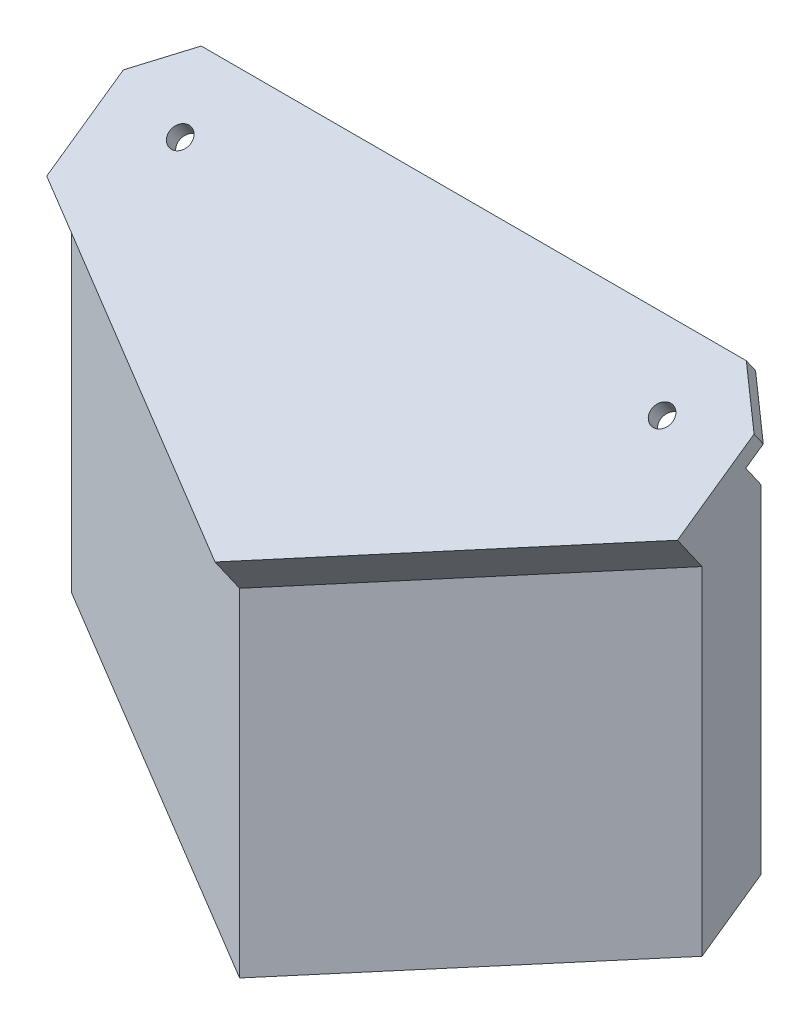
ISO-10303-21;
HEADER;
FILE_DESCRIPTION(('STEP AP214'),'2;1');
FILE_NAME('part.step','',(''),(''),'','','');
FILE_SCHEMA(('AUTOMOTIVE_DESIGN { 1 0 10303 214 1 1 1 1 }'));
ENDSEC;
DATA;
#1=APPLICATION_CONTEXT('core data for automotive mechanical design processes');
#2=APPLICATION_PROTOCOL_DEFINITION('international standard','automotive_design',2000,#1);
#3=PRODUCT_CONTEXT('',#1,'mechanical');
#4=PRODUCT('Part','Part','',(#3));
#5=PRODUCT_RELATED_PRODUCT_CATEGORY('part','',(#4));
#6=PRODUCT_DEFINITION_FORMATION('','',#4);
#7=PRODUCT_DEFINITION_CONTEXT('part definition',#1,'design');
#8=PRODUCT_DEFINITION('design','',#6,#7);
#9=PRODUCT_DEFINITION_SHAPE('','',#8);
#10=(LENGTH_UNIT() NAMED_UNIT(*) SI_UNIT(.MILLI.,.METRE.));
#11=(NAMED_UNIT(*) PLANE_ANGLE_UNIT() SI_UNIT($,.RADIAN.));
#12=(NAMED_UNIT(*) SI_UNIT($,.STERADIAN.) SOLID_ANGLE_UNIT());
#13=UNCERTAINTY_MEASURE_WITH_UNIT(LENGTH_MEASURE(1.E-05),#10,'distance_accuracy_value','');
#14=(GEOMETRIC_REPRESENTATION_CONTEXT(3) GLOBAL_UNCERTAINTY_ASSIGNED_CONTEXT((#13)) GLOBAL_UNIT_ASSIGNED_CONTEXT((#10,
#11,#12)) REPRESENTATION_CONTEXT('',''));
#15=CARTESIAN_POINT('',(0.,0.,0.));
#16=DIRECTION('',(0.,0.,1.));
#17=DIRECTION('',(1.,0.,0.));
#18=AXIS2_PLACEMENT_3D('',#15,#16,#17);
#19=CARTESIAN_POINT('',(45.,122.341674123379,-4.82430299363382));
#20=DIRECTION('',(0.,-0.819152044288995,-0.573576436351042));
#21=DIRECTION('',(0.,0.573576436351042,-0.819152044288995));
#22=AXIS2_PLACEMENT_3D('',#19,#20,#21);
#23=CYLINDRICAL_SURFACE('',#22,2.);
#24=CARTESIAN_POINT('',(45.,96.5532163543121,-22.8815755223373));
#25=DIRECTION('',(0.,-0.819152044288995,-0.573576436351042));
#26=DIRECTION('',(0.,0.573576436351042,-0.819152044288995));
#27=AXIS2_PLACEMENT_3D('',#24,#25,#26);
#28=CIRCLE('',#27,2.);
#29=CARTESIAN_POINT('',(45.,97.7003692270141,-24.5198796109152));
#30=VERTEX_POINT('',#29);
#31=EDGE_CURVE('E172',#30,#30,#28,.T.);
#32=ORIENTED_EDGE('',*,*,#31,.F.);
#33=EDGE_LOOP('',(#32));
#34=FACE_BOUND('',#33,.T.);
#35=CARTESIAN_POINT('',(45.,94.0957602214451,-24.6023048313904));
#36=DIRECTION('',(0.,-0.819152044288995,-0.573576436351041));
#37=DIRECTION('',(0.,0.573576436351041,-0.819152044288995));
#38=AXIS2_PLACEMENT_3D('',#35,#36,#37);
#39=CIRCLE('',#38,2.);
#40=CARTESIAN_POINT('',(45.,95.2429130941472,-26.2406089199683));
#41=VERTEX_POINT('',#40);
#42=EDGE_CURVE('E167',#41,#41,#39,.F.);
#43=ORIENTED_EDGE('',*,*,#42,.F.);
#44=EDGE_LOOP('',(#43));
#45=FACE_BOUND('',#44,.T.);
#46=ADVANCED_FACE('F37',(#34,#45),#23,.F.);
#47=CARTESIAN_POINT('',(-45.,122.341674123379,-4.82430299363382));
#48=DIRECTION('',(0.,-0.819152044288995,-0.573576436351042));
#49=DIRECTION('',(0.,0.573576436351042,-0.819152044288995));
#50=AXIS2_PLACEMENT_3D('',#47,#48,#49);
#51=CYLINDRICAL_SURFACE('',#50,2.);
#52=CARTESIAN_POINT('',(-45.,96.5532163543121,-22.8815755223373));
#53=DIRECTION('',(0.,-0.819152044288995,-0.573576436351042));
#54=DIRECTION('',(0.,0.573576436351042,-0.819152044288995));
#55=AXIS2_PLACEMENT_3D('',#52,#53,#54);
#56=CIRCLE('',#55,2.);
#57=CARTESIAN_POINT('',(-45.,97.7003692270141,-24.5198796109152));
#58=VERTEX_POINT('',#57);
#59=EDGE_CURVE('E175',#58,#58,#56,.T.);
#60=ORIENTED_EDGE('',*,*,#59,.F.);
#61=EDGE_LOOP('',(#60));
#62=FACE_BOUND('',#61,.T.);
#63=CARTESIAN_POINT('',(-45.,94.0957602214451,-24.6023048313904));
#64=DIRECTION('',(0.,-0.819152044288995,-0.573576436351041));
#65=DIRECTION('',(0.,0.573576436351041,-0.819152044288995));
#66=AXIS2_PLACEMENT_3D('',#63,#64,#65);
#67=CIRCLE('',#66,2.);
#68=CARTESIAN_POINT('',(-45.,95.2429130941472,-26.2406089199684));
#69=VERTEX_POINT('',#68);
#70=EDGE_CURVE('E164',#69,#69,#67,.F.);
#71=ORIENTED_EDGE('',*,*,#70,.F.);
#72=EDGE_LOOP('',(#71));
#73=FACE_BOUND('',#72,.T.);
#74=ADVANCED_FACE('F261',(#62,#73),#51,.F.);
#75=CARTESIAN_POINT('',(-58.9100061573822,113.265958121992,-25.8284828175927));
#76=DIRECTION('',(0.,-0.573576436351042,0.819152044288995));
#77=DIRECTION('',(0.,-0.819152044288995,-0.573576436351042));
#78=AXIS2_PLACEMENT_3D('',#75,#76,#77);
#79=PLANE('',#78);
#80=DIRECTION('',(-1.,0.,0.));
#81=VECTOR('',#80,1.);
#82=CARTESIAN_POINT('',(0.,103.436133590525,-32.7114000538052));
#83=LINE('',#82,#81);
#84=CARTESIAN_POINT('',(50.9100061573822,103.436133590525,-32.7114000538052));
#85=VERTEX_POINT('',#84);
#86=CARTESIAN_POINT('',(-50.9100061573822,103.436133590525,-32.7114000538052));
#87=VERTEX_POINT('',#86);
#88=EDGE_CURVE('E170',#85,#87,#83,.T.);
#89=ORIENTED_EDGE('',*,*,#88,.F.);
#90=DIRECTION('',(0.,-0.819152044288995,-0.573576436351042));
#91=VECTOR('',#90,1.);
#92=CARTESIAN_POINT('',(50.9100061573822,113.265958121992,-25.8284828175927));
#93=LINE('',#92,#91);
#94=CARTESIAN_POINT('',(50.9100061573822,100.978677457658,-34.4321293628584));
#95=VERTEX_POINT('',#94);
#96=EDGE_CURVE('E233',#85,#95,#93,.T.);
#97=ORIENTED_EDGE('',*,*,#96,.T.);
#98=DIRECTION('',(1.,0.,0.));
#99=VECTOR('',#98,1.);
#100=CARTESIAN_POINT('',(-58.9100061573822,100.978677457658,-34.4321293628583));
#101=LINE('',#100,#99);
#102=CARTESIAN_POINT('',(-50.9100061573822,100.978677457658,-34.4321293628583));
#103=VERTEX_POINT('',#102);
#104=EDGE_CURVE('E144',#103,#95,#101,.T.);
#105=ORIENTED_EDGE('',*,*,#104,.F.);
#106=DIRECTION('',(0.,0.819152044288995,0.573576436351042));
#107=VECTOR('',#106,1.);
#108=CARTESIAN_POINT('',(-50.9100061573822,113.265958121992,-25.8284828175927));
#109=LINE('',#108,#107);
#110=EDGE_CURVE('E231',#103,#87,#109,.T.);
#111=ORIENTED_EDGE('',*,*,#110,.T.);
#112=EDGE_LOOP('',(#89,#97,#105,#111));
#113=FACE_BOUND('',#112,.T.);
#114=ADVANCED_FACE('F246',(#113),#79,.F.);
#115=CARTESIAN_POINT('',(4.22618261740701,90.,9.06307787036649));
#116=DIRECTION('',(-0.422618261740701,0.,-0.906307787036649));
#117=DIRECTION('',(-0.906307787036649,0.,0.422618261740701));
#118=AXIS2_PLACEMENT_3D('',#115,#116,#117);
#119=PLANE('',#118);
#120=DIRECTION('',(0.,-1.,0.));
#121=VECTOR('',#120,1.);
#122=CARTESIAN_POINT('',(58.9100061573822,90.,-16.4364078235206));
#123=LINE('',#122,#121);
#124=CARTESIAN_POINT('',(58.9100061573822,82.2740646364833,-16.4364078235206));
#125=VERTEX_POINT('',#124);
#126=CARTESIAN_POINT('',(58.9100061573822,19.2348320226348,-16.4364078235206));
#127=VERTEX_POINT('',#126);
#128=EDGE_CURVE('E180',#125,#127,#123,.T.);
#129=ORIENTED_EDGE('',*,*,#128,.F.);
#130=DIRECTION('',(-0.869055102665145,-0.283757039059194,0.405247049731437));
#131=VECTOR('',#130,1.);
#132=CARTESIAN_POINT('',(10.5344373945289,66.4788542834744,6.1214903582017));
#133=LINE('',#132,#131);
#134=CARTESIAN_POINT('',(0.,63.0392326138486,11.0337791896249));
#135=VERTEX_POINT('',#134);
#136=EDGE_CURVE('E220',#125,#135,#133,.T.);
#137=ORIENTED_EDGE('',*,*,#136,.T.);
#138=DIRECTION('',(0.,-1.,0.));
#139=VECTOR('',#138,1.);
#140=CARTESIAN_POINT('',(0.,90.,11.0337791896249));
#141=LINE('',#140,#139);
#142=CARTESIAN_POINT('',(0.,0.,11.0337791896249));
#143=VERTEX_POINT('',#142);
#144=EDGE_CURVE('E222',#135,#143,#141,.T.);
#145=ORIENTED_EDGE('',*,*,#144,.T.);
#146=DIRECTION('',(0.869055102665145,0.283757039059194,-0.405247049731437));
#147=VECTOR('',#146,1.);
#148=CARTESIAN_POINT('',(26.079943847654,8.51541820805782,-1.1274983507885));
#149=LINE('',#148,#147);
#150=EDGE_CURVE('E210',#143,#127,#149,.T.);
#151=ORIENTED_EDGE('',*,*,#150,.T.);
#152=EDGE_LOOP('',(#129,#137,#145,#151));
#153=FACE_BOUND('',#152,.T.);
#154=ADVANCED_FACE('F299',(#153),#119,.F.);
#155=CARTESIAN_POINT('',(-63.1361887747892,90.,-18.4071091427791));
#156=DIRECTION('',(0.422618261740701,0.,-0.906307787036649));
#157=DIRECTION('',(-0.906307787036649,0.,-0.422618261740701));
#158=AXIS2_PLACEMENT_3D('',#155,#156,#157);
#159=PLANE('',#158);
#160=DIRECTION('',(0.,1.,0.));
#161=VECTOR('',#160,1.);
#162=CARTESIAN_POINT('',(-58.9100061573822,90.,-16.4364078235206));
#163=LINE('',#162,#161);
#164=CARTESIAN_POINT('',(-58.9100061573822,19.2348320226348,-16.4364078235206));
#165=VERTEX_POINT('',#164);
#166=CARTESIAN_POINT('',(-58.9100061573822,82.2740646364833,-16.4364078235206));
#167=VERTEX_POINT('',#166);
#168=EDGE_CURVE('E187',#165,#167,#163,.T.);
#169=ORIENTED_EDGE('',*,*,#168,.F.);
#170=DIRECTION('',(0.869055102665145,-0.283757039059194,0.405247049731437));
#171=VECTOR('',#170,1.);
#172=CARTESIAN_POINT('',(-80.2466307586823,26.2014989253608,-26.3858392742852));
#173=LINE('',#172,#171);
#174=EDGE_CURVE('E203',#165,#143,#173,.T.);
#175=ORIENTED_EDGE('',*,*,#174,.T.);
#176=ORIENTED_EDGE('',*,*,#144,.F.);
#177=DIRECTION('',(-0.869055102665145,0.283757039059194,-0.405247049731437));
#178=VECTOR('',#177,1.);
#179=CARTESIAN_POINT('',(-64.7011243055572,84.1649350007774,-19.136850565295));
#180=LINE('',#179,#178);
#181=EDGE_CURVE('E213',#135,#167,#180,.T.);
#182=ORIENTED_EDGE('',*,*,#181,.T.);
#183=EDGE_LOOP('',(#169,#175,#176,#182));
#184=FACE_BOUND('',#183,.T.);
#185=ADVANCED_FACE('F295',(#184),#159,.F.);
#186=CARTESIAN_POINT('',(-63.1361887747892,0.,11.0337791896249));
#187=DIRECTION('',(0.,0.819152044288995,0.573576436351042));
#188=DIRECTION('',(0.,-0.573576436351042,0.819152044288995));
#189=AXIS2_PLACEMENT_3D('',#186,#187,#188);
#190=PLANE('',#189);
#191=DIRECTION('',(0.,-0.573576436351042,0.819152044288995));
#192=VECTOR('',#191,1.);
#193=CARTESIAN_POINT('',(-58.9100061573822,0.,11.0337791896249));
#194=LINE('',#193,#192);
#195=CARTESIAN_POINT('',(-58.9100061573822,26.9607673861515,-27.4701870131455));
#196=VERTEX_POINT('',#195);
#197=EDGE_CURVE('E189',#196,#165,#194,.T.);
#198=ORIENTED_EDGE('',*,*,#197,.F.);
#199=DIRECTION('',(0.869055102665145,-0.283757039059194,0.405247049731437));
#200=VECTOR('',#199,1.);
#201=CARTESIAN_POINT('',(-74.4555126105073,32.0365639245834,-34.7191757221358));
#202=LINE('',#201,#200);
#203=CARTESIAN_POINT('',(0.,7.72593536351671,0.));
#204=VERTEX_POINT('',#203);
#205=EDGE_CURVE('E205',#196,#204,#202,.T.);
#206=ORIENTED_EDGE('',*,*,#205,.T.);
#207=DIRECTION('',(0.869055102665145,0.283757039059194,-0.405247049731437));
#208=VECTOR('',#207,1.);
#209=CARTESIAN_POINT('',(20.288825699479,14.3504832072804,-9.46083479863902));
#210=LINE('',#209,#208);
#211=CARTESIAN_POINT('',(58.9100061573822,26.9607673861515,-27.4701870131455));
#212=VERTEX_POINT('',#211);
#213=EDGE_CURVE('E207',#204,#212,#210,.T.);
#214=ORIENTED_EDGE('',*,*,#213,.T.);
#215=DIRECTION('',(0.,0.573576436351042,-0.819152044288995));
#216=VECTOR('',#215,1.);
#217=CARTESIAN_POINT('',(58.9100061573822,0.,11.0337791896249));
#218=LINE('',#217,#216);
#219=EDGE_CURVE('E182',#127,#212,#218,.T.);
#220=ORIENTED_EDGE('',*,*,#219,.F.);
#221=ORIENTED_EDGE('',*,*,#150,.F.);
#222=ORIENTED_EDGE('',*,*,#174,.F.);
#223=EDGE_LOOP('',(#198,#206,#214,#220,#221,#222));
#224=FACE_BOUND('',#223,.T.);
#225=ADVANCED_FACE('F291',(#224),#190,.F.);
#226=CARTESIAN_POINT('',(63.1361887747892,90.2071809100998,-13.8184976519707));
#227=DIRECTION('',(-0.494715300482687,0.498469528779363,-0.711888263947936));
#228=DIRECTION('',(0.,0.819152044288995,0.573576436351042));
#229=AXIS2_PLACEMENT_3D('',#226,#227,#228);
#230=PLANE('',#229);
#231=DIRECTION('',(0.,-0.819152044288995,-0.573576436351042));
#232=VECTOR('',#231,1.);
#233=CARTESIAN_POINT('',(58.9100061573822,88.8272809907953,-11.8477963327123));
#234=LINE('',#233,#232);
#235=CARTESIAN_POINT('',(58.9100061573822,88.8272809907953,-11.8477963327123));
#236=VERTEX_POINT('',#235);
#237=EDGE_CURVE('E178',#236,#125,#234,.T.);
#238=ORIENTED_EDGE('',*,*,#237,.F.);
#239=DIRECTION('',(0.869055102665145,0.283757039059194,-0.405247049731437));
#240=VECTOR('',#239,1.);
#241=CARTESIAN_POINT('',(63.1361887747892,90.2071809100998,-13.8184976519707));
#242=LINE('',#241,#240);
#243=CARTESIAN_POINT('',(0.,69.5924489681605,15.6223906804333));
#244=VERTEX_POINT('',#243);
#245=EDGE_CURVE('E191',#244,#236,#242,.T.);
#246=ORIENTED_EDGE('',*,*,#245,.F.);
#247=DIRECTION('',(0.,-0.819152044288995,-0.573576436351042));
#248=VECTOR('',#247,1.);
#249=CARTESIAN_POINT('',(0.,69.5924489681605,15.6223906804333));
#250=LINE('',#249,#248);
#251=EDGE_CURVE('E200',#244,#135,#250,.T.);
#252=ORIENTED_EDGE('',*,*,#251,.T.);
#253=ORIENTED_EDGE('',*,*,#136,.F.);
#254=EDGE_LOOP('',(#238,#246,#252,#253));
#255=FACE_BOUND('',#254,.T.);
#256=ADVANCED_FACE('F280',(#255),#230,.F.);
#257=CARTESIAN_POINT('',(0.,69.5924489681605,15.6223906804333));
#258=DIRECTION('',(0.494715300482687,0.498469528779363,-0.711888263947936));
#259=DIRECTION('',(0.,0.819152044288995,0.573576436351042));
#260=AXIS2_PLACEMENT_3D('',#257,#258,#259);
#261=PLANE('',#260);
#262=DIRECTION('',(0.,0.819152044288995,0.573576436351042));
#263=VECTOR('',#262,1.);
#264=CARTESIAN_POINT('',(-58.9100061573822,88.8272809907953,-11.8477963327123));
#265=LINE('',#264,#263);
#266=CARTESIAN_POINT('',(-58.9100061573822,88.8272809907953,-11.8477963327123));
#267=VERTEX_POINT('',#266);
#268=EDGE_CURVE('E184',#167,#267,#265,.T.);
#269=ORIENTED_EDGE('',*,*,#268,.F.);
#270=ORIENTED_EDGE('',*,*,#181,.F.);
#271=ORIENTED_EDGE('',*,*,#251,.F.);
#272=DIRECTION('',(0.869055102665145,-0.283757039059194,0.405247049731437));
#273=VECTOR('',#272,1.);
#274=CARTESIAN_POINT('',(0.,69.5924489681605,15.6223906804333));
#275=LINE('',#274,#273);
#276=EDGE_CURVE('E198',#267,#244,#275,.T.);
#277=ORIENTED_EDGE('',*,*,#276,.F.);
#278=EDGE_LOOP('',(#269,#270,#271,#277));
#279=FACE_BOUND('',#278,.T.);
#280=ADVANCED_FACE('F276',(#279),#261,.F.);
#281=CARTESIAN_POINT('',(0.,54.0373567900367,37.8373645693109));
#282=DIRECTION('',(0.,-0.819152044288995,-0.573576436351042));
#283=DIRECTION('',(0.,0.573576436351042,-0.819152044288995));
#284=AXIS2_PLACEMENT_3D('',#281,#282,#283);
#285=PLANE('',#284);
#286=ORIENTED_EDGE('',*,*,#59,.T.);
#287=EDGE_LOOP('',(#286));
#288=FACE_BOUND('',#287,.T.);
#289=ORIENTED_EDGE('',*,*,#31,.T.);
#290=EDGE_LOOP('',(#289));
#291=FACE_BOUND('',#290,.T.);
#292=DIRECTION('',(0.,0.573576436351042,-0.819152044288995));
#293=VECTOR('',#292,1.);
#294=CARTESIAN_POINT('',(58.9100061573822,96.553216354312,-22.8815755223372));
#295=LINE('',#294,#293);
#296=CARTESIAN_POINT('',(58.9100061573822,98.8475220997162,-26.1581836994932));
#297=VERTEX_POINT('',#296);
#298=EDGE_CURVE('E194',#236,#297,#295,.T.);
#299=ORIENTED_EDGE('',*,*,#298,.T.);
#300=DIRECTION('',(0.707106781186546,-0.405579787672637,0.579227965339572));
#301=VECTOR('',#300,1.);
#302=CARTESIAN_POINT('',(50.9100061573822,103.436133590525,-32.7114000538052));
#303=LINE('',#302,#301);
#304=EDGE_CURVE('E46',#297,#85,#303,.F.);
#305=ORIENTED_EDGE('',*,*,#304,.T.);
#306=ORIENTED_EDGE('',*,*,#88,.T.);
#307=DIRECTION('',(0.707106781186548,0.405579787672636,-0.579227965339571));
#308=VECTOR('',#307,1.);
#309=CARTESIAN_POINT('',(-58.9100061573822,98.8475220997162,-26.1581836994932));
#310=LINE('',#309,#308);
#311=CARTESIAN_POINT('',(-58.9100061573822,98.8475220997162,-26.1581836994932));
#312=VERTEX_POINT('',#311);
#313=EDGE_CURVE('E53',#87,#312,#310,.F.);
#314=ORIENTED_EDGE('',*,*,#313,.T.);
#315=DIRECTION('',(0.,-0.573576436351042,0.819152044288995));
#316=VECTOR('',#315,1.);
#317=CARTESIAN_POINT('',(-58.9100061573822,96.553216354312,-22.8815755223372));
#318=LINE('',#317,#316);
#319=EDGE_CURVE('E196',#312,#267,#318,.T.);
#320=ORIENTED_EDGE('',*,*,#319,.T.);
#321=ORIENTED_EDGE('',*,*,#276,.T.);
#322=ORIENTED_EDGE('',*,*,#245,.T.);
#323=EDGE_LOOP('',(#299,#305,#306,#314,#320,#321,#322));
#324=FACE_BOUND('',#323,.T.);
#325=ADVANCED_FACE('F242',(#288,#291,#324),#285,.F.);
#326=CARTESIAN_POINT('',(0.,90.,0.));
#327=DIRECTION('',(-0.422618261740701,0.,-0.906307787036649));
#328=DIRECTION('',(-0.906307787036649,0.,0.422618261740701));
#329=AXIS2_PLACEMENT_3D('',#326,#327,#328);
#330=PLANE('',#329);
#331=ORIENTED_EDGE('',*,*,#213,.F.);
#332=DIRECTION('',(0.,-1.,0.));
#333=VECTOR('',#332,1.);
#334=CARTESIAN_POINT('',(0.,90.,0.));
#335=LINE('',#334,#333);
#336=CARTESIAN_POINT('',(0.,70.7651679773653,0.));
#337=VERTEX_POINT('',#336);
#338=EDGE_CURVE('E227',#337,#204,#335,.T.);
#339=ORIENTED_EDGE('',*,*,#338,.F.);
#340=DIRECTION('',(-0.869055102665145,-0.283757039059194,0.405247049731437));
#341=VECTOR('',#340,1.);
#342=CARTESIAN_POINT('',(4.74331924635387,72.313919282697,-2.21184608964881));
#343=LINE('',#342,#341);
#344=CARTESIAN_POINT('',(58.9100061573822,90.0000000000001,-27.4701870131456));
#345=VERTEX_POINT('',#344);
#346=EDGE_CURVE('E218',#345,#337,#343,.T.);
#347=ORIENTED_EDGE('',*,*,#346,.F.);
#348=DIRECTION('',(0.,-1.,0.));
#349=VECTOR('',#348,1.);
#350=CARTESIAN_POINT('',(58.9100061573822,90.,-27.4701870131455));
#351=LINE('',#350,#349);
#352=EDGE_CURVE('E156',#345,#212,#351,.T.);
#353=ORIENTED_EDGE('',*,*,#352,.T.);
#354=EDGE_LOOP('',(#331,#339,#347,#353));
#355=FACE_BOUND('',#354,.T.);
#356=ADVANCED_FACE('F275',(#355),#330,.T.);
#357=CARTESIAN_POINT('',(-58.9100061573822,90.,-27.4701870131456));
#358=DIRECTION('',(0.422618261740701,0.,-0.906307787036649));
#359=DIRECTION('',(-0.906307787036649,0.,-0.422618261740701));
#360=AXIS2_PLACEMENT_3D('',#357,#358,#359);
#361=PLANE('',#360);
#362=ORIENTED_EDGE('',*,*,#205,.F.);
#363=DIRECTION('',(0.,-1.,0.));
#364=VECTOR('',#363,1.);
#365=CARTESIAN_POINT('',(-58.9100061573822,90.,-27.4701870131456));
#366=LINE('',#365,#364);
#367=CARTESIAN_POINT('',(-58.9100061573822,90.0000000000001,-27.4701870131455));
#368=VERTEX_POINT('',#367);
#369=EDGE_CURVE('E225',#368,#196,#366,.T.);
#370=ORIENTED_EDGE('',*,*,#369,.F.);
#371=DIRECTION('',(-0.869055102665145,0.283757039059194,-0.405247049731437));
#372=VECTOR('',#371,1.);
#373=CARTESIAN_POINT('',(-58.9100061573822,90.,-27.4701870131456));
#374=LINE('',#373,#372);
#375=EDGE_CURVE('E216',#337,#368,#374,.T.);
#376=ORIENTED_EDGE('',*,*,#375,.F.);
#377=ORIENTED_EDGE('',*,*,#338,.T.);
#378=EDGE_LOOP('',(#362,#370,#376,#377));
#379=FACE_BOUND('',#378,.T.);
#380=ADVANCED_FACE('F288',(#379),#361,.T.);
#381=CARTESIAN_POINT('',(58.9100061573822,96.553216354312,-22.8815755223372));
#382=DIRECTION('',(-1.,0.,0.));
#383=DIRECTION('',(0.,0.,1.));
#384=AXIS2_PLACEMENT_3D('',#381,#382,#383);
#385=PLANE('',#384);
#386=DIRECTION('',(0.,-0.573576436351042,0.819152044288995));
#387=VECTOR('',#386,1.);
#388=CARTESIAN_POINT('',(58.9100061573822,100.978677457658,-34.4321293628584));
#389=LINE('',#388,#387);
#390=CARTESIAN_POINT('',(58.9100061573822,96.3900659668492,-27.8789130085463));
#391=VERTEX_POINT('',#390);
#392=CARTESIAN_POINT('',(58.9100061573822,94.0957602214451,-24.6023048313904));
#393=VERTEX_POINT('',#392);
#394=EDGE_CURVE('E134',#391,#393,#389,.T.);
#395=ORIENTED_EDGE('',*,*,#394,.F.);
#396=DIRECTION('',(0.,0.819152044288995,0.573576436351042));
#397=VECTOR('',#396,1.);
#398=CARTESIAN_POINT('',(58.9100061573822,98.8475220997162,-26.1581836994932));
#399=LINE('',#398,#397);
#400=EDGE_CURVE('E61',#391,#297,#399,.T.);
#401=ORIENTED_EDGE('',*,*,#400,.T.);
#402=ORIENTED_EDGE('',*,*,#298,.F.);
#403=ORIENTED_EDGE('',*,*,#237,.T.);
#404=ORIENTED_EDGE('',*,*,#128,.T.);
#405=ORIENTED_EDGE('',*,*,#219,.T.);
#406=ORIENTED_EDGE('',*,*,#352,.F.);
#407=DIRECTION('',(0.,-0.819152044288995,-0.573576436351042));
#408=VECTOR('',#407,1.);
#409=CARTESIAN_POINT('',(58.9100061573822,94.0957602214451,-24.6023048313904));
#410=LINE('',#409,#408);
#411=EDGE_CURVE('E149',#393,#345,#410,.T.);
#412=ORIENTED_EDGE('',*,*,#411,.F.);
#413=EDGE_LOOP('',(#395,#401,#402,#403,#404,#405,#406,#412));
#414=FACE_BOUND('',#413,.T.);
#415=ADVANCED_FACE('F154',(#414),#385,.F.);
#416=CARTESIAN_POINT('',(-58.9100061573822,96.553216354312,-22.8815755223372));
#417=DIRECTION('',(1.,0.,0.));
#418=DIRECTION('',(0.,0.,-1.));
#419=AXIS2_PLACEMENT_3D('',#416,#417,#418);
#420=PLANE('',#419);
#421=ORIENTED_EDGE('',*,*,#319,.F.);
#422=DIRECTION('',(0.,-0.819152044288995,-0.573576436351042));
#423=VECTOR('',#422,1.);
#424=CARTESIAN_POINT('',(-58.9100061573822,98.8475220997162,-26.1581836994932));
#425=LINE('',#424,#423);
#426=CARTESIAN_POINT('',(-58.9100061573822,96.3900659668492,-27.8789130085463));
#427=VERTEX_POINT('',#426);
#428=EDGE_CURVE('E12',#312,#427,#425,.T.);
#429=ORIENTED_EDGE('',*,*,#428,.T.);
#430=DIRECTION('',(0.,0.573576436351041,-0.819152044288995));
#431=VECTOR('',#430,1.);
#432=CARTESIAN_POINT('',(-58.9100061573822,94.095760221445,-24.6023048313903));
#433=LINE('',#432,#431);
#434=CARTESIAN_POINT('',(-58.9100061573822,94.095760221445,-24.6023048313903));
#435=VERTEX_POINT('',#434);
#436=EDGE_CURVE('E333',#435,#427,#433,.T.);
#437=ORIENTED_EDGE('',*,*,#436,.F.);
#438=DIRECTION('',(0.,-0.819152044288995,-0.573576436351042));
#439=VECTOR('',#438,1.);
#440=CARTESIAN_POINT('',(-58.9100061573822,94.095760221445,-24.6023048313903));
#441=LINE('',#440,#439);
#442=EDGE_CURVE('E159',#435,#368,#441,.T.);
#443=ORIENTED_EDGE('',*,*,#442,.T.);
#444=ORIENTED_EDGE('',*,*,#369,.T.);
#445=ORIENTED_EDGE('',*,*,#197,.T.);
#446=ORIENTED_EDGE('',*,*,#168,.T.);
#447=ORIENTED_EDGE('',*,*,#268,.T.);
#448=EDGE_LOOP('',(#421,#429,#437,#443,#444,#445,#446,#447));
#449=FACE_BOUND('',#448,.T.);
#450=ADVANCED_FACE('F282',(#449),#420,.F.);
#451=CARTESIAN_POINT('',(0.,51.5799006571698,36.1166352602578));
#452=DIRECTION('',(0.,-0.819152044288995,-0.573576436351041));
#453=DIRECTION('',(0.,0.573576436351041,-0.819152044288995));
#454=AXIS2_PLACEMENT_3D('',#451,#452,#453);
#455=PLANE('',#454);
#456=ORIENTED_EDGE('',*,*,#104,.T.);
#457=DIRECTION('',(-0.707106781186546,0.405579787672636,-0.579227965339573));
#458=VECTOR('',#457,1.);
#459=CARTESIAN_POINT('',(68.5170726388977,90.879679010594,-20.0092648605926));
#460=LINE('',#459,#458);
#461=EDGE_CURVE('E142',#95,#391,#460,.F.);
#462=ORIENTED_EDGE('',*,*,#461,.T.);
#463=ORIENTED_EDGE('',*,*,#394,.T.);
#464=DIRECTION('',(-0.869055102665144,-0.283757039059194,0.405247049731437));
#465=VECTOR('',#464,1.);
#466=CARTESIAN_POINT('',(58.9100061573822,94.0957602214451,-24.6023048313904));
#467=LINE('',#466,#465);
#468=CARTESIAN_POINT('',(0.,74.8609281988103,2.86788218175524));
#469=VERTEX_POINT('',#468);
#470=EDGE_CURVE('E140',#393,#469,#467,.T.);
#471=ORIENTED_EDGE('',*,*,#470,.T.);
#472=DIRECTION('',(-0.869055102665145,0.283757039059194,-0.405247049731437));
#473=VECTOR('',#472,1.);
#474=CARTESIAN_POINT('',(0.,74.8609281988103,2.86788218175524));
#475=LINE('',#474,#473);
#476=EDGE_CURVE('E152',#469,#435,#475,.T.);
#477=ORIENTED_EDGE('',*,*,#476,.T.);
#478=ORIENTED_EDGE('',*,*,#436,.T.);
#479=DIRECTION('',(-0.707106781186548,-0.405579787672635,0.579227965339572));
#480=VECTOR('',#479,1.);
#481=CARTESIAN_POINT('',(-68.5170726388975,90.8796790105941,-20.0092648605927));
#482=LINE('',#481,#480);
#483=EDGE_CURVE('E236',#427,#103,#482,.F.);
#484=ORIENTED_EDGE('',*,*,#483,.T.);
#485=EDGE_LOOP('',(#456,#462,#463,#471,#477,#478,#484));
#486=FACE_BOUND('',#485,.T.);
#487=ORIENTED_EDGE('',*,*,#70,.T.);
#488=EDGE_LOOP('',(#487));
#489=FACE_BOUND('',#488,.T.);
#490=ORIENTED_EDGE('',*,*,#42,.T.);
#491=EDGE_LOOP('',(#490));
#492=FACE_BOUND('',#491,.T.);
#493=ADVANCED_FACE('F137',(#486,#489,#492),#455,.T.);
#494=CARTESIAN_POINT('',(0.,74.8609281988103,2.86788218175524));
#495=DIRECTION('',(-0.494715300482687,-0.498469528779363,0.711888263947935));
#496=DIRECTION('',(0.,-0.819152044288995,-0.573576436351042));
#497=AXIS2_PLACEMENT_3D('',#494,#495,#496);
#498=PLANE('',#497);
#499=ORIENTED_EDGE('',*,*,#375,.T.);
#500=ORIENTED_EDGE('',*,*,#442,.F.);
#501=ORIENTED_EDGE('',*,*,#476,.F.);
#502=DIRECTION('',(0.,-0.819152044288995,-0.573576436351042));
#503=VECTOR('',#502,1.);
#504=CARTESIAN_POINT('',(0.,74.8609281988103,2.86788218175524));
#505=LINE('',#504,#503);
#506=EDGE_CURVE('E151',#469,#337,#505,.T.);
#507=ORIENTED_EDGE('',*,*,#506,.T.);
#508=EDGE_LOOP('',(#499,#500,#501,#507));
#509=FACE_BOUND('',#508,.T.);
#510=ADVANCED_FACE('F256',(#509),#498,.F.);
#511=CARTESIAN_POINT('',(58.9100061573822,94.0957602214451,-24.6023048313904));
#512=DIRECTION('',(0.494715300482687,-0.498469528779362,0.711888263947935));
#513=DIRECTION('',(0.,-0.819152044288995,-0.573576436351042));
#514=AXIS2_PLACEMENT_3D('',#511,#512,#513);
#515=PLANE('',#514);
#516=ORIENTED_EDGE('',*,*,#346,.T.);
#517=ORIENTED_EDGE('',*,*,#506,.F.);
#518=ORIENTED_EDGE('',*,*,#470,.F.);
#519=ORIENTED_EDGE('',*,*,#411,.T.);
#520=EDGE_LOOP('',(#516,#517,#518,#519));
#521=FACE_BOUND('',#520,.T.);
#522=ADVANCED_FACE('F148',(#521),#515,.F.);
#523=CARTESIAN_POINT('',(50.9100061573822,113.265958121992,-25.8284828175927));
#524=DIRECTION('',(-0.707106781186549,-0.405579787672635,0.57922796533957));
#525=DIRECTION('',(0.,-0.819152044288995,-0.573576436351042));
#526=AXIS2_PLACEMENT_3D('',#523,#524,#525);
#527=PLANE('',#526);
#528=ORIENTED_EDGE('',*,*,#304,.F.);
#529=ORIENTED_EDGE('',*,*,#400,.F.);
#530=ORIENTED_EDGE('',*,*,#461,.F.);
#531=ORIENTED_EDGE('',*,*,#96,.F.);
#532=EDGE_LOOP('',(#528,#529,#530,#531));
#533=FACE_BOUND('',#532,.T.);
#534=ADVANCED_FACE('F249',(#533),#527,.F.);
#535=CARTESIAN_POINT('',(-58.9100061573822,98.8475220997162,-26.1581836994932));
#536=DIRECTION('',(0.707106781186547,-0.405579787672636,0.579227965339571));
#537=DIRECTION('',(0.,-0.819152044288995,-0.573576436351042));
#538=AXIS2_PLACEMENT_3D('',#535,#536,#537);
#539=PLANE('',#538);
#540=ORIENTED_EDGE('',*,*,#313,.F.);
#541=ORIENTED_EDGE('',*,*,#110,.F.);
#542=ORIENTED_EDGE('',*,*,#483,.F.);
#543=ORIENTED_EDGE('',*,*,#428,.F.);
#544=EDGE_LOOP('',(#540,#541,#542,#543));
#545=FACE_BOUND('',#544,.T.);
#546=ADVANCED_FACE('F40',(#545),#539,.F.);
#547=CLOSED_SHELL('',(#46,#74,#114,#154,#185,#225,#256,#280,#325,#356,#380,#415,#450,#493,#510,
#522,#534,#546));
#548=MANIFOLD_SOLID_BREP('B2',#547);
#549=ADVANCED_BREP_SHAPE_REPRESENTATION('',(#18,#548),#14);
#550=SHAPE_DEFINITION_REPRESENTATION(#9,#549);
ENDSEC;
END-ISO-10303-21;
